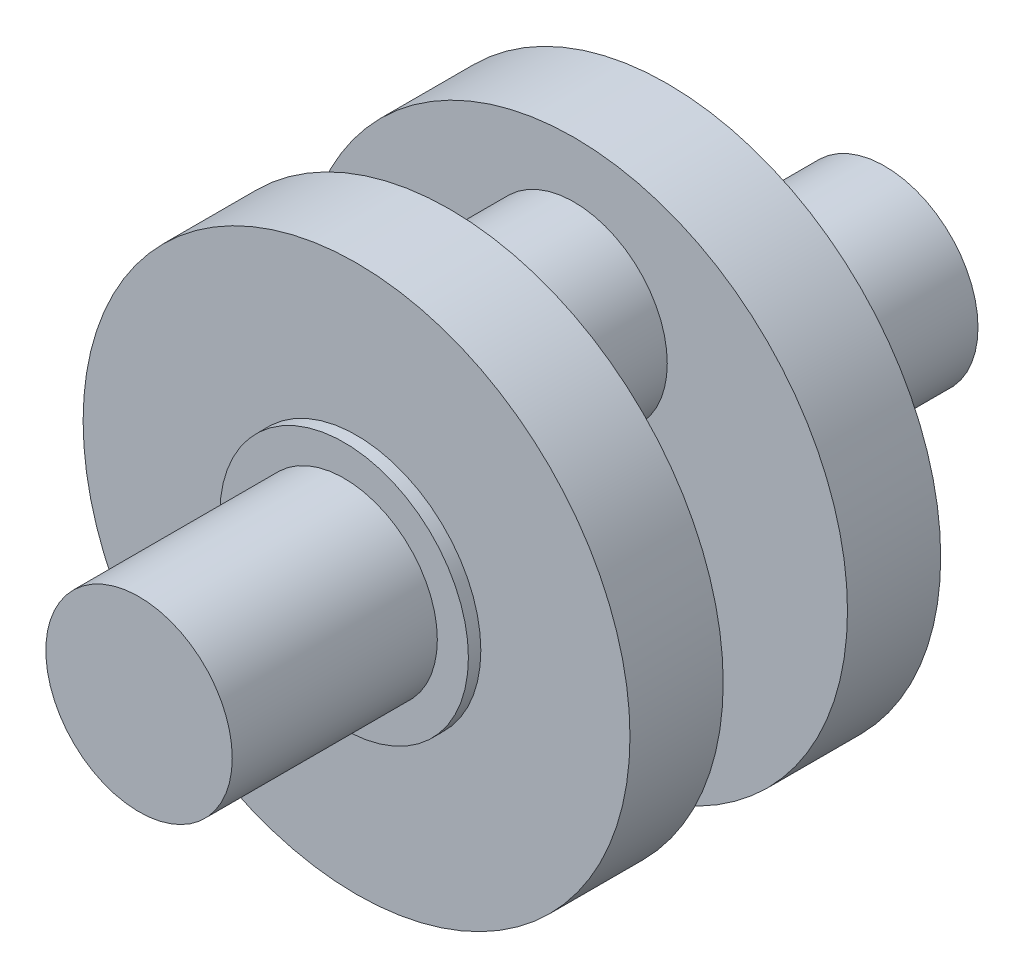
ISO-10303-21;
HEADER;
FILE_DESCRIPTION(('STEP AP214'),'2;1');
FILE_NAME('part.step','',(''),(''),'','','');
FILE_SCHEMA(('AUTOMOTIVE_DESIGN { 1 0 10303 214 1 1 1 1 }'));
ENDSEC;
DATA;
#1=APPLICATION_CONTEXT('core data for automotive mechanical design processes');
#2=APPLICATION_PROTOCOL_DEFINITION('international standard','automotive_design',2000,#1);
#3=PRODUCT_CONTEXT('',#1,'mechanical');
#4=PRODUCT('Part','Part','',(#3));
#5=PRODUCT_RELATED_PRODUCT_CATEGORY('part','',(#4));
#6=PRODUCT_DEFINITION_FORMATION('','',#4);
#7=PRODUCT_DEFINITION_CONTEXT('part definition',#1,'design');
#8=PRODUCT_DEFINITION('design','',#6,#7);
#9=PRODUCT_DEFINITION_SHAPE('','',#8);
#10=(LENGTH_UNIT() NAMED_UNIT(*) SI_UNIT(.MILLI.,.METRE.));
#11=(NAMED_UNIT(*) PLANE_ANGLE_UNIT() SI_UNIT($,.RADIAN.));
#12=(NAMED_UNIT(*) SI_UNIT($,.STERADIAN.) SOLID_ANGLE_UNIT());
#13=UNCERTAINTY_MEASURE_WITH_UNIT(LENGTH_MEASURE(1.E-05),#10,'distance_accuracy_value','');
#14=(GEOMETRIC_REPRESENTATION_CONTEXT(3) GLOBAL_UNCERTAINTY_ASSIGNED_CONTEXT((#13)) GLOBAL_UNIT_ASSIGNED_CONTEXT((#10,
#11,#12)) REPRESENTATION_CONTEXT('',''));
#15=CARTESIAN_POINT('',(0.,0.,0.));
#16=DIRECTION('',(0.,0.,1.));
#17=DIRECTION('',(1.,0.,0.));
#18=AXIS2_PLACEMENT_3D('',#15,#16,#17);
#19=CARTESIAN_POINT('',(0.,0.,33.));
#20=DIRECTION('',(0.,0.,-1.));
#21=DIRECTION('',(-1.,0.,0.));
#22=AXIS2_PLACEMENT_3D('',#19,#20,#21);
#23=CYLINDRICAL_SURFACE('',#22,15.);
#24=CARTESIAN_POINT('',(0.,0.,33.));
#25=DIRECTION('',(0.,0.,1.));
#26=DIRECTION('',(1.,0.,0.));
#27=AXIS2_PLACEMENT_3D('',#24,#25,#26);
#28=CIRCLE('',#27,15.);
#29=CARTESIAN_POINT('',(15.,0.,33.));
#30=VERTEX_POINT('',#29);
#31=EDGE_CURVE('E10',#30,#30,#28,.T.);
#32=ORIENTED_EDGE('',*,*,#31,.F.);
#33=EDGE_LOOP('',(#32));
#34=FACE_BOUND('',#33,.T.);
#35=CARTESIAN_POINT('',(0.,0.,0.));
#36=DIRECTION('',(0.,0.,1.));
#37=DIRECTION('',(1.,0.,0.));
#38=AXIS2_PLACEMENT_3D('',#35,#36,#37);
#39=CIRCLE('',#38,15.);
#40=CARTESIAN_POINT('',(15.,0.,0.));
#41=VERTEX_POINT('',#40);
#42=EDGE_CURVE('E38',#41,#41,#39,.T.);
#43=ORIENTED_EDGE('',*,*,#42,.T.);
#44=EDGE_LOOP('',(#43));
#45=FACE_BOUND('',#44,.T.);
#46=ADVANCED_FACE('F35',(#34,#45),#23,.T.);
#47=CARTESIAN_POINT('',(0.,0.,33.));
#48=DIRECTION('',(0.,0.,1.));
#49=DIRECTION('',(1.,0.,0.));
#50=AXIS2_PLACEMENT_3D('',#47,#48,#49);
#51=PLANE('',#50);
#52=ORIENTED_EDGE('',*,*,#31,.T.);
#53=EDGE_LOOP('',(#52));
#54=FACE_BOUND('',#53,.T.);
#55=ADVANCED_FACE('F105',(#54),#51,.T.);
#56=CARTESIAN_POINT('',(0.,0.,-2.00000000000001));
#57=DIRECTION('',(0.,0.,1.));
#58=DIRECTION('',(1.,0.,0.));
#59=AXIS2_PLACEMENT_3D('',#56,#57,#58);
#60=CYLINDRICAL_SURFACE('',#59,20.);
#61=CARTESIAN_POINT('',(0.,0.,-2.00000000000001));
#62=DIRECTION('',(0.,0.,1.));
#63=DIRECTION('',(1.,0.,0.));
#64=AXIS2_PLACEMENT_3D('',#61,#62,#63);
#65=CIRCLE('',#64,20.);
#66=CARTESIAN_POINT('',(20.,0.,-2.00000000000001));
#67=VERTEX_POINT('',#66);
#68=EDGE_CURVE('E49',#67,#67,#65,.T.);
#69=ORIENTED_EDGE('',*,*,#68,.T.);
#70=EDGE_LOOP('',(#69));
#71=FACE_BOUND('',#70,.T.);
#72=CARTESIAN_POINT('',(0.,0.,0.));
#73=DIRECTION('',(0.,0.,1.));
#74=DIRECTION('',(1.,0.,0.));
#75=AXIS2_PLACEMENT_3D('',#72,#73,#74);
#76=CIRCLE('',#75,20.);
#77=CARTESIAN_POINT('',(20.,0.,0.));
#78=VERTEX_POINT('',#77);
#79=EDGE_CURVE('E45',#78,#78,#76,.T.);
#80=ORIENTED_EDGE('',*,*,#79,.F.);
#81=EDGE_LOOP('',(#80));
#82=FACE_BOUND('',#81,.T.);
#83=ADVANCED_FACE('F110',(#71,#82),#60,.T.);
#84=CARTESIAN_POINT('',(0.,0.,0.));
#85=DIRECTION('',(0.,0.,1.));
#86=DIRECTION('',(1.,0.,0.));
#87=AXIS2_PLACEMENT_3D('',#84,#85,#86);
#88=PLANE('',#87);
#89=ORIENTED_EDGE('',*,*,#42,.F.);
#90=EDGE_LOOP('',(#89));
#91=FACE_BOUND('',#90,.T.);
#92=ORIENTED_EDGE('',*,*,#79,.T.);
#93=EDGE_LOOP('',(#92));
#94=FACE_BOUND('',#93,.T.);
#95=ADVANCED_FACE('F114',(#91,#94),#88,.T.);
#96=CARTESIAN_POINT('',(0.,0.,-17.));
#97=DIRECTION('',(0.,0.,1.));
#98=DIRECTION('',(1.,0.,0.));
#99=AXIS2_PLACEMENT_3D('',#96,#97,#98);
#100=CYLINDRICAL_SURFACE('',#99,44.);
#101=CARTESIAN_POINT('',(0.,0.,-17.));
#102=DIRECTION('',(0.,0.,1.));
#103=DIRECTION('',(1.,0.,0.));
#104=AXIS2_PLACEMENT_3D('',#101,#102,#103);
#105=CIRCLE('',#104,44.);
#106=CARTESIAN_POINT('',(44.,0.,-17.));
#107=VERTEX_POINT('',#106);
#108=EDGE_CURVE('E52',#107,#107,#105,.T.);
#109=ORIENTED_EDGE('',*,*,#108,.T.);
#110=EDGE_LOOP('',(#109));
#111=FACE_BOUND('',#110,.T.);
#112=CARTESIAN_POINT('',(0.,0.,-2.00000000000001));
#113=DIRECTION('',(0.,0.,1.));
#114=DIRECTION('',(1.,0.,0.));
#115=AXIS2_PLACEMENT_3D('',#112,#113,#114);
#116=CIRCLE('',#115,44.);
#117=CARTESIAN_POINT('',(44.,0.,-2.00000000000001));
#118=VERTEX_POINT('',#117);
#119=EDGE_CURVE('E53',#118,#118,#116,.T.);
#120=ORIENTED_EDGE('',*,*,#119,.F.);
#121=EDGE_LOOP('',(#120));
#122=FACE_BOUND('',#121,.T.);
#123=ADVANCED_FACE('F117',(#111,#122),#100,.T.);
#124=CARTESIAN_POINT('',(0.,0.,-17.));
#125=DIRECTION('',(0.,0.,1.));
#126=DIRECTION('',(1.,0.,0.));
#127=AXIS2_PLACEMENT_3D('',#124,#125,#126);
#128=PLANE('',#127);
#129=CARTESIAN_POINT('',(0.,20.,-17.));
#130=DIRECTION('',(0.,0.,1.));
#131=DIRECTION('',(1.,0.,0.));
#132=AXIS2_PLACEMENT_3D('',#129,#130,#131);
#133=CIRCLE('',#132,15.);
#134=CARTESIAN_POINT('',(15.,20.,-17.));
#135=VERTEX_POINT('',#134);
#136=EDGE_CURVE('E56',#135,#135,#133,.T.);
#137=ORIENTED_EDGE('',*,*,#136,.T.);
#138=EDGE_LOOP('',(#137));
#139=FACE_BOUND('',#138,.T.);
#140=ORIENTED_EDGE('',*,*,#108,.F.);
#141=EDGE_LOOP('',(#140));
#142=FACE_BOUND('',#141,.T.);
#143=ADVANCED_FACE('F129',(#139,#142),#128,.F.);
#144=CARTESIAN_POINT('',(0.,0.,-2.00000000000001));
#145=DIRECTION('',(0.,0.,1.));
#146=DIRECTION('',(1.,0.,0.));
#147=AXIS2_PLACEMENT_3D('',#144,#145,#146);
#148=PLANE('',#147);
#149=ORIENTED_EDGE('',*,*,#68,.F.);
#150=EDGE_LOOP('',(#149));
#151=FACE_BOUND('',#150,.T.);
#152=ORIENTED_EDGE('',*,*,#119,.T.);
#153=EDGE_LOOP('',(#152));
#154=FACE_BOUND('',#153,.T.);
#155=ADVANCED_FACE('F131',(#151,#154),#148,.T.);
#156=CARTESIAN_POINT('',(0.,20.,-27.));
#157=DIRECTION('',(0.,0.,1.));
#158=DIRECTION('',(1.,0.,0.));
#159=AXIS2_PLACEMENT_3D('',#156,#157,#158);
#160=CYLINDRICAL_SURFACE('',#159,15.);
#161=ORIENTED_EDGE('',*,*,#136,.F.);
#162=EDGE_LOOP('',(#161));
#163=FACE_BOUND('',#162,.T.);
#164=CARTESIAN_POINT('',(0.,20.,-37.));
#165=DIRECTION('',(0.,0.,1.));
#166=DIRECTION('',(1.,0.,0.));
#167=AXIS2_PLACEMENT_3D('',#164,#165,#166);
#168=CIRCLE('',#167,15.);
#169=CARTESIAN_POINT('',(15.,20.,-37.));
#170=VERTEX_POINT('',#169);
#171=EDGE_CURVE('E77',#170,#170,#168,.T.);
#172=ORIENTED_EDGE('',*,*,#171,.T.);
#173=EDGE_LOOP('',(#172));
#174=FACE_BOUND('',#173,.T.);
#175=ADVANCED_FACE('F83',(#163,#174),#160,.T.);
#176=CARTESIAN_POINT('',(0.,0.,-87.));
#177=DIRECTION('',(0.,0.,1.));
#178=DIRECTION('',(-1.,0.,0.));
#179=AXIS2_PLACEMENT_3D('',#176,#177,#178);
#180=CYLINDRICAL_SURFACE('',#179,15.);
#181=CARTESIAN_POINT('',(0.,0.,-87.));
#182=DIRECTION('',(0.,0.,1.));
#183=DIRECTION('',(1.,0.,0.));
#184=AXIS2_PLACEMENT_3D('',#181,#182,#183);
#185=CIRCLE('',#184,15.);
#186=CARTESIAN_POINT('',(15.,0.,-87.));
#187=VERTEX_POINT('',#186);
#188=EDGE_CURVE('E61',#187,#187,#185,.T.);
#189=ORIENTED_EDGE('',*,*,#188,.T.);
#190=EDGE_LOOP('',(#189));
#191=FACE_BOUND('',#190,.T.);
#192=CARTESIAN_POINT('',(0.,0.,-54.));
#193=DIRECTION('',(0.,0.,1.));
#194=DIRECTION('',(1.,0.,0.));
#195=AXIS2_PLACEMENT_3D('',#192,#193,#194);
#196=CIRCLE('',#195,15.);
#197=CARTESIAN_POINT('',(15.,0.,-54.));
#198=VERTEX_POINT('',#197);
#199=EDGE_CURVE('E62',#198,#198,#196,.T.);
#200=ORIENTED_EDGE('',*,*,#199,.F.);
#201=EDGE_LOOP('',(#200));
#202=FACE_BOUND('',#201,.T.);
#203=ADVANCED_FACE('F140',(#191,#202),#180,.T.);
#204=CARTESIAN_POINT('',(0.,0.,-87.));
#205=DIRECTION('',(0.,0.,-1.));
#206=DIRECTION('',(1.,0.,0.));
#207=AXIS2_PLACEMENT_3D('',#204,#205,#206);
#208=PLANE('',#207);
#209=ORIENTED_EDGE('',*,*,#188,.F.);
#210=EDGE_LOOP('',(#209));
#211=FACE_BOUND('',#210,.T.);
#212=ADVANCED_FACE('F144',(#211),#208,.T.);
#213=CARTESIAN_POINT('',(0.,0.,-52.));
#214=DIRECTION('',(0.,0.,-1.));
#215=DIRECTION('',(1.,0.,0.));
#216=AXIS2_PLACEMENT_3D('',#213,#214,#215);
#217=CYLINDRICAL_SURFACE('',#216,20.);
#218=CARTESIAN_POINT('',(0.,0.,-52.));
#219=DIRECTION('',(0.,0.,1.));
#220=DIRECTION('',(1.,0.,0.));
#221=AXIS2_PLACEMENT_3D('',#218,#219,#220);
#222=CIRCLE('',#221,20.);
#223=CARTESIAN_POINT('',(20.,0.,-52.));
#224=VERTEX_POINT('',#223);
#225=EDGE_CURVE('E70',#224,#224,#222,.T.);
#226=ORIENTED_EDGE('',*,*,#225,.F.);
#227=EDGE_LOOP('',(#226));
#228=FACE_BOUND('',#227,.T.);
#229=CARTESIAN_POINT('',(0.,0.,-54.));
#230=DIRECTION('',(0.,0.,1.));
#231=DIRECTION('',(1.,0.,0.));
#232=AXIS2_PLACEMENT_3D('',#229,#230,#231);
#233=CIRCLE('',#232,20.);
#234=CARTESIAN_POINT('',(20.,0.,-54.));
#235=VERTEX_POINT('',#234);
#236=EDGE_CURVE('E65',#235,#235,#233,.T.);
#237=ORIENTED_EDGE('',*,*,#236,.T.);
#238=EDGE_LOOP('',(#237));
#239=FACE_BOUND('',#238,.T.);
#240=ADVANCED_FACE('F148',(#228,#239),#217,.T.);
#241=CARTESIAN_POINT('',(0.,0.,-54.));
#242=DIRECTION('',(0.,0.,-1.));
#243=DIRECTION('',(1.,0.,0.));
#244=AXIS2_PLACEMENT_3D('',#241,#242,#243);
#245=PLANE('',#244);
#246=ORIENTED_EDGE('',*,*,#199,.T.);
#247=EDGE_LOOP('',(#246));
#248=FACE_BOUND('',#247,.T.);
#249=ORIENTED_EDGE('',*,*,#236,.F.);
#250=EDGE_LOOP('',(#249));
#251=FACE_BOUND('',#250,.T.);
#252=ADVANCED_FACE('F95',(#248,#251),#245,.T.);
#253=CARTESIAN_POINT('',(0.,0.,-37.));
#254=DIRECTION('',(0.,0.,-1.));
#255=DIRECTION('',(1.,0.,0.));
#256=AXIS2_PLACEMENT_3D('',#253,#254,#255);
#257=CYLINDRICAL_SURFACE('',#256,44.);
#258=CARTESIAN_POINT('',(0.,0.,-37.));
#259=DIRECTION('',(0.,0.,1.));
#260=DIRECTION('',(1.,0.,0.));
#261=AXIS2_PLACEMENT_3D('',#258,#259,#260);
#262=CIRCLE('',#261,44.);
#263=CARTESIAN_POINT('',(44.,0.,-37.));
#264=VERTEX_POINT('',#263);
#265=EDGE_CURVE('E73',#264,#264,#262,.T.);
#266=ORIENTED_EDGE('',*,*,#265,.F.);
#267=EDGE_LOOP('',(#266));
#268=FACE_BOUND('',#267,.T.);
#269=CARTESIAN_POINT('',(0.,0.,-52.));
#270=DIRECTION('',(0.,0.,1.));
#271=DIRECTION('',(1.,0.,0.));
#272=AXIS2_PLACEMENT_3D('',#269,#270,#271);
#273=CIRCLE('',#272,44.);
#274=CARTESIAN_POINT('',(44.,0.,-52.));
#275=VERTEX_POINT('',#274);
#276=EDGE_CURVE('E74',#275,#275,#273,.T.);
#277=ORIENTED_EDGE('',*,*,#276,.T.);
#278=EDGE_LOOP('',(#277));
#279=FACE_BOUND('',#278,.T.);
#280=ADVANCED_FACE('F89',(#268,#279),#257,.T.);
#281=CARTESIAN_POINT('',(0.,0.,-37.));
#282=DIRECTION('',(0.,0.,-1.));
#283=DIRECTION('',(1.,0.,0.));
#284=AXIS2_PLACEMENT_3D('',#281,#282,#283);
#285=PLANE('',#284);
#286=ORIENTED_EDGE('',*,*,#171,.F.);
#287=EDGE_LOOP('',(#286));
#288=FACE_BOUND('',#287,.T.);
#289=ORIENTED_EDGE('',*,*,#265,.T.);
#290=EDGE_LOOP('',(#289));
#291=FACE_BOUND('',#290,.T.);
#292=ADVANCED_FACE('F85',(#288,#291),#285,.F.);
#293=CARTESIAN_POINT('',(0.,0.,-52.));
#294=DIRECTION('',(0.,0.,-1.));
#295=DIRECTION('',(1.,0.,0.));
#296=AXIS2_PLACEMENT_3D('',#293,#294,#295);
#297=PLANE('',#296);
#298=ORIENTED_EDGE('',*,*,#225,.T.);
#299=EDGE_LOOP('',(#298));
#300=FACE_BOUND('',#299,.T.);
#301=ORIENTED_EDGE('',*,*,#276,.F.);
#302=EDGE_LOOP('',(#301));
#303=FACE_BOUND('',#302,.T.);
#304=ADVANCED_FACE('F88',(#300,#303),#297,.T.);
#305=CLOSED_SHELL('',(#46,#55,#83,#95,#123,#143,#155,#175,#203,#212,#240,#252,#280,#292,#304));
#306=MANIFOLD_SOLID_BREP('B2',#305);
#307=ADVANCED_BREP_SHAPE_REPRESENTATION('',(#18,#306),#14);
#308=SHAPE_DEFINITION_REPRESENTATION(#9,#307);
ENDSEC;
END-ISO-10303-21;
